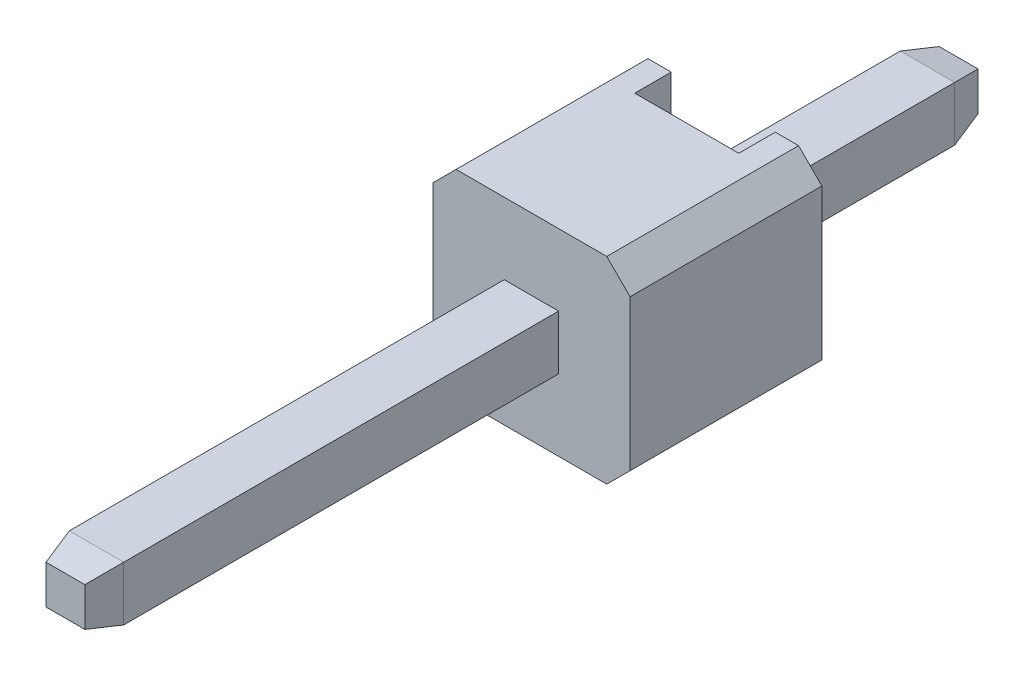
ISO-10303-21;
HEADER;
FILE_DESCRIPTION(('STEP AP214'),'2;1');
FILE_NAME('part.step','',(''),(''),'','','');
FILE_SCHEMA(('AUTOMOTIVE_DESIGN { 1 0 10303 214 1 1 1 1 }'));
ENDSEC;
DATA;
#1=APPLICATION_CONTEXT('core data for automotive mechanical design processes');
#2=APPLICATION_PROTOCOL_DEFINITION('international standard','automotive_design',2000,#1);
#3=PRODUCT_CONTEXT('',#1,'mechanical');
#4=PRODUCT('Part','Part','',(#3));
#5=PRODUCT_RELATED_PRODUCT_CATEGORY('part','',(#4));
#6=PRODUCT_DEFINITION_FORMATION('','',#4);
#7=PRODUCT_DEFINITION_CONTEXT('part definition',#1,'design');
#8=PRODUCT_DEFINITION('design','',#6,#7);
#9=PRODUCT_DEFINITION_SHAPE('','',#8);
#10=(LENGTH_UNIT() NAMED_UNIT(*) SI_UNIT(.MILLI.,.METRE.));
#11=(NAMED_UNIT(*) PLANE_ANGLE_UNIT() SI_UNIT($,.RADIAN.));
#12=(NAMED_UNIT(*) SI_UNIT($,.STERADIAN.) SOLID_ANGLE_UNIT());
#13=UNCERTAINTY_MEASURE_WITH_UNIT(LENGTH_MEASURE(1.E-05),#10,'distance_accuracy_value','');
#14=(GEOMETRIC_REPRESENTATION_CONTEXT(3) GLOBAL_UNCERTAINTY_ASSIGNED_CONTEXT((#13)) GLOBAL_UNIT_ASSIGNED_CONTEXT((#10,
#11,#12)) REPRESENTATION_CONTEXT('',''));
#15=CARTESIAN_POINT('',(0.,0.,0.));
#16=DIRECTION('',(0.,0.,1.));
#17=DIRECTION('',(1.,0.,0.));
#18=AXIS2_PLACEMENT_3D('',#15,#16,#17);
#19=CARTESIAN_POINT('',(0.,-0.25,8.5));
#20=DIRECTION('',(0.,0.970142500145391,-0.242535625036098));
#21=DIRECTION('',(-1.,0.,0.));
#22=AXIS2_PLACEMENT_3D('',#19,#20,#21);
#23=PLANE('',#22);
#24=DIRECTION('',(-0.23570226039596,-0.23570226039596,-0.942809041581841));
#25=VECTOR('',#24,1.);
#26=CARTESIAN_POINT('',(-0.236111111111,-0.236111111111,8.555555555556));
#27=LINE('',#26,#25);
#28=CARTESIAN_POINT('',(-0.25,-0.25,8.5));
#29=VERTEX_POINT('',#28);
#30=CARTESIAN_POINT('',(-0.35,-0.35,8.1));
#31=VERTEX_POINT('',#30);
#32=EDGE_CURVE('E26',#29,#31,#27,.T.);
#33=ORIENTED_EDGE('',*,*,#32,.T.);
#34=DIRECTION('',(-1.,0.,0.));
#35=VECTOR('',#34,1.);
#36=CARTESIAN_POINT('',(-0.35,-0.35,8.1));
#37=LINE('',#36,#35);
#38=CARTESIAN_POINT('',(0.35,-0.35,8.1));
#39=VERTEX_POINT('',#38);
#40=EDGE_CURVE('E487',#39,#31,#37,.T.);
#41=ORIENTED_EDGE('',*,*,#40,.F.);
#42=DIRECTION('',(-0.23570226039596,0.23570226039596,0.942809041581841));
#43=VECTOR('',#42,1.);
#44=CARTESIAN_POINT('',(0.236111111111,-0.236111111111,8.555555555556));
#45=LINE('',#44,#43);
#46=CARTESIAN_POINT('',(0.25,-0.25,8.5));
#47=VERTEX_POINT('',#46);
#48=EDGE_CURVE('E11',#39,#47,#45,.T.);
#49=ORIENTED_EDGE('',*,*,#48,.T.);
#50=DIRECTION('',(1.,0.,0.));
#51=VECTOR('',#50,1.);
#52=CARTESIAN_POINT('',(0.,-0.25,8.5));
#53=LINE('',#52,#51);
#54=EDGE_CURVE('E452',#29,#47,#53,.T.);
#55=ORIENTED_EDGE('',*,*,#54,.F.);
#56=EDGE_LOOP('',(#33,#41,#49,#55));
#57=FACE_BOUND('',#56,.T.);
#58=ADVANCED_FACE('F17',(#57),#23,.F.);
#59=CARTESIAN_POINT('',(0.25,0.,8.5));
#60=DIRECTION('',(-0.970142500145391,0.,-0.242535625036098));
#61=DIRECTION('',(-0.242535625036098,0.,0.970142500145391));
#62=AXIS2_PLACEMENT_3D('',#59,#60,#61);
#63=PLANE('',#62);
#64=DIRECTION('',(-0.23570226039596,-0.23570226039596,0.942809041581841));
#65=VECTOR('',#64,1.);
#66=CARTESIAN_POINT('',(0.236111111111,0.236111111111,8.555555555556));
#67=LINE('',#66,#65);
#68=CARTESIAN_POINT('',(0.35,0.35,8.1));
#69=VERTEX_POINT('',#68);
#70=CARTESIAN_POINT('',(0.25,0.25,8.5));
#71=VERTEX_POINT('',#70);
#72=EDGE_CURVE('E519',#69,#71,#67,.T.);
#73=ORIENTED_EDGE('',*,*,#72,.T.);
#74=DIRECTION('',(0.,1.,0.));
#75=VECTOR('',#74,1.);
#76=CARTESIAN_POINT('',(0.25,0.,8.5));
#77=LINE('',#76,#75);
#78=EDGE_CURVE('E456',#47,#71,#77,.T.);
#79=ORIENTED_EDGE('',*,*,#78,.F.);
#80=ORIENTED_EDGE('',*,*,#48,.F.);
#81=DIRECTION('',(0.,-1.,0.));
#82=VECTOR('',#81,1.);
#83=CARTESIAN_POINT('',(0.35,0.35,8.1));
#84=LINE('',#83,#82);
#85=EDGE_CURVE('E491',#69,#39,#84,.T.);
#86=ORIENTED_EDGE('',*,*,#85,.F.);
#87=EDGE_LOOP('',(#73,#79,#80,#86));
#88=FACE_BOUND('',#87,.T.);
#89=ADVANCED_FACE('F556',(#88),#63,.F.);
#90=CARTESIAN_POINT('',(-0.25,0.,8.5));
#91=DIRECTION('',(0.970142500145391,0.,-0.242535625036098));
#92=DIRECTION('',(0.,-1.,0.));
#93=AXIS2_PLACEMENT_3D('',#90,#91,#92);
#94=PLANE('',#93);
#95=DIRECTION('',(-0.23570226039596,0.23570226039596,-0.942809041581841));
#96=VECTOR('',#95,1.);
#97=CARTESIAN_POINT('',(-0.236111111111,0.236111111111,8.555555555556));
#98=LINE('',#97,#96);
#99=CARTESIAN_POINT('',(-0.25,0.25,8.5));
#100=VERTEX_POINT('',#99);
#101=CARTESIAN_POINT('',(-0.35,0.35,8.1));
#102=VERTEX_POINT('',#101);
#103=EDGE_CURVE('E20',#100,#102,#98,.T.);
#104=ORIENTED_EDGE('',*,*,#103,.T.);
#105=DIRECTION('',(0.,1.,0.));
#106=VECTOR('',#105,1.);
#107=CARTESIAN_POINT('',(-0.35,0.35,8.1));
#108=LINE('',#107,#106);
#109=EDGE_CURVE('E477',#31,#102,#108,.T.);
#110=ORIENTED_EDGE('',*,*,#109,.F.);
#111=ORIENTED_EDGE('',*,*,#32,.F.);
#112=DIRECTION('',(0.,-1.,0.));
#113=VECTOR('',#112,1.);
#114=CARTESIAN_POINT('',(-0.25,0.,8.5));
#115=LINE('',#114,#113);
#116=EDGE_CURVE('E383',#100,#29,#115,.T.);
#117=ORIENTED_EDGE('',*,*,#116,.F.);
#118=EDGE_LOOP('',(#104,#110,#111,#117));
#119=FACE_BOUND('',#118,.T.);
#120=ADVANCED_FACE('F562',(#119),#94,.F.);
#121=CARTESIAN_POINT('',(0.,0.25,8.5));
#122=DIRECTION('',(0.,-0.970142500145391,-0.242535625036098));
#123=DIRECTION('',(0.,0.242535625036098,-0.970142500145391));
#124=AXIS2_PLACEMENT_3D('',#121,#122,#123);
#125=PLANE('',#124);
#126=ORIENTED_EDGE('',*,*,#72,.F.);
#127=DIRECTION('',(1.,0.,0.));
#128=VECTOR('',#127,1.);
#129=CARTESIAN_POINT('',(-0.35,0.35,8.1));
#130=LINE('',#129,#128);
#131=EDGE_CURVE('E402',#102,#69,#130,.T.);
#132=ORIENTED_EDGE('',*,*,#131,.F.);
#133=ORIENTED_EDGE('',*,*,#103,.F.);
#134=DIRECTION('',(-1.,0.,0.));
#135=VECTOR('',#134,1.);
#136=CARTESIAN_POINT('',(0.,0.25,8.5));
#137=LINE('',#136,#135);
#138=EDGE_CURVE('E403',#71,#100,#137,.T.);
#139=ORIENTED_EDGE('',*,*,#138,.F.);
#140=EDGE_LOOP('',(#126,#132,#133,#139));
#141=FACE_BOUND('',#140,.T.);
#142=ADVANCED_FACE('F585',(#141),#125,.F.);
#143=CARTESIAN_POINT('',(-0.35,0.35,-2.6));
#144=DIRECTION('',(0.,0.970142500145391,-0.242535625036098));
#145=DIRECTION('',(-1.,0.,0.));
#146=AXIS2_PLACEMENT_3D('',#143,#144,#145);
#147=PLANE('',#146);
#148=DIRECTION('',(-0.23570226039596,-0.23570226039596,-0.942809041581841));
#149=VECTOR('',#148,1.);
#150=CARTESIAN_POINT('',(0.35,0.35,-2.6));
#151=LINE('',#150,#149);
#152=CARTESIAN_POINT('',(0.35,0.35,-2.6));
#153=VERTEX_POINT('',#152);
#154=CARTESIAN_POINT('',(0.25,0.25,-3.));
#155=VERTEX_POINT('',#154);
#156=EDGE_CURVE('E49',#153,#155,#151,.T.);
#157=ORIENTED_EDGE('',*,*,#156,.T.);
#158=DIRECTION('',(1.,0.,0.));
#159=VECTOR('',#158,1.);
#160=CARTESIAN_POINT('',(0.35,0.25,-3.));
#161=LINE('',#160,#159);
#162=CARTESIAN_POINT('',(-0.25,0.25,-3.));
#163=VERTEX_POINT('',#162);
#164=EDGE_CURVE('E508',#163,#155,#161,.T.);
#165=ORIENTED_EDGE('',*,*,#164,.F.);
#166=DIRECTION('',(-0.23570226039596,0.23570226039596,0.942809041581841));
#167=VECTOR('',#166,1.);
#168=CARTESIAN_POINT('',(-0.35,0.35,-2.6));
#169=LINE('',#168,#167);
#170=CARTESIAN_POINT('',(-0.35,0.35,-2.6));
#171=VERTEX_POINT('',#170);
#172=EDGE_CURVE('E522',#163,#171,#169,.T.);
#173=ORIENTED_EDGE('',*,*,#172,.T.);
#174=DIRECTION('',(-1.,0.,0.));
#175=VECTOR('',#174,1.);
#176=CARTESIAN_POINT('',(-0.35,0.35,-2.6));
#177=LINE('',#176,#175);
#178=EDGE_CURVE('E339',#153,#171,#177,.T.);
#179=ORIENTED_EDGE('',*,*,#178,.F.);
#180=EDGE_LOOP('',(#157,#165,#173,#179));
#181=FACE_BOUND('',#180,.T.);
#182=ADVANCED_FACE('F527',(#181),#147,.T.);
#183=CARTESIAN_POINT('',(-0.35,0.35,-2.6));
#184=DIRECTION('',(-0.970142500145391,0.,-0.242535625036098));
#185=DIRECTION('',(-0.242535625036098,0.,0.970142500145391));
#186=AXIS2_PLACEMENT_3D('',#183,#184,#185);
#187=PLANE('',#186);
#188=DIRECTION('',(-0.23570226039596,-0.23570226039596,0.942809041581841));
#189=VECTOR('',#188,1.);
#190=CARTESIAN_POINT('',(-0.35,-0.35,-2.6));
#191=LINE('',#190,#189);
#192=CARTESIAN_POINT('',(-0.25,-0.25,-3.));
#193=VERTEX_POINT('',#192);
#194=CARTESIAN_POINT('',(-0.35,-0.35,-2.6));
#195=VERTEX_POINT('',#194);
#196=EDGE_CURVE('E462',#193,#195,#191,.T.);
#197=ORIENTED_EDGE('',*,*,#196,.T.);
#198=DIRECTION('',(0.,-1.,0.));
#199=VECTOR('',#198,1.);
#200=CARTESIAN_POINT('',(-0.35,-0.35,-2.6));
#201=LINE('',#200,#199);
#202=EDGE_CURVE('E242',#171,#195,#201,.T.);
#203=ORIENTED_EDGE('',*,*,#202,.F.);
#204=ORIENTED_EDGE('',*,*,#172,.F.);
#205=DIRECTION('',(0.,1.,0.));
#206=VECTOR('',#205,1.);
#207=CARTESIAN_POINT('',(-0.25,0.35,-3.));
#208=LINE('',#207,#206);
#209=EDGE_CURVE('E427',#193,#163,#208,.T.);
#210=ORIENTED_EDGE('',*,*,#209,.F.);
#211=EDGE_LOOP('',(#197,#203,#204,#210));
#212=FACE_BOUND('',#211,.T.);
#213=ADVANCED_FACE('F533',(#212),#187,.T.);
#214=CARTESIAN_POINT('',(0.35,0.35,-2.6));
#215=DIRECTION('',(0.970142500145391,0.,-0.242535625036098));
#216=DIRECTION('',(0.,-1.,0.));
#217=AXIS2_PLACEMENT_3D('',#214,#215,#216);
#218=PLANE('',#217);
#219=DIRECTION('',(-0.23570226039596,0.23570226039596,-0.942809041581841));
#220=VECTOR('',#219,1.);
#221=CARTESIAN_POINT('',(0.311111111111,-0.311111111111,-2.755555555556));
#222=LINE('',#221,#220);
#223=CARTESIAN_POINT('',(0.35,-0.35,-2.6));
#224=VERTEX_POINT('',#223);
#225=CARTESIAN_POINT('',(0.25,-0.25,-3.));
#226=VERTEX_POINT('',#225);
#227=EDGE_CURVE('E39',#224,#226,#222,.T.);
#228=ORIENTED_EDGE('',*,*,#227,.T.);
#229=DIRECTION('',(0.,-1.,0.));
#230=VECTOR('',#229,1.);
#231=CARTESIAN_POINT('',(0.25,-0.35,-3.));
#232=LINE('',#231,#230);
#233=EDGE_CURVE('E512',#155,#226,#232,.T.);
#234=ORIENTED_EDGE('',*,*,#233,.F.);
#235=ORIENTED_EDGE('',*,*,#156,.F.);
#236=DIRECTION('',(0.,1.,0.));
#237=VECTOR('',#236,1.);
#238=CARTESIAN_POINT('',(0.35,0.35,-2.6));
#239=LINE('',#238,#237);
#240=EDGE_CURVE('E320',#224,#153,#239,.T.);
#241=ORIENTED_EDGE('',*,*,#240,.F.);
#242=EDGE_LOOP('',(#228,#234,#235,#241));
#243=FACE_BOUND('',#242,.T.);
#244=ADVANCED_FACE('F538',(#243),#218,.T.);
#245=CARTESIAN_POINT('',(-0.35,-0.35,-2.6));
#246=DIRECTION('',(0.,-0.970142500145391,-0.242535625036098));
#247=DIRECTION('',(0.,0.242535625036098,-0.970142500145391));
#248=AXIS2_PLACEMENT_3D('',#245,#246,#247);
#249=PLANE('',#248);
#250=ORIENTED_EDGE('',*,*,#196,.F.);
#251=DIRECTION('',(-1.,0.,0.));
#252=VECTOR('',#251,1.);
#253=CARTESIAN_POINT('',(-0.35,-0.25,-3.));
#254=LINE('',#253,#252);
#255=EDGE_CURVE('E497',#226,#193,#254,.T.);
#256=ORIENTED_EDGE('',*,*,#255,.F.);
#257=ORIENTED_EDGE('',*,*,#227,.F.);
#258=DIRECTION('',(1.,0.,0.));
#259=VECTOR('',#258,1.);
#260=CARTESIAN_POINT('',(0.35,-0.35,-2.6));
#261=LINE('',#260,#259);
#262=EDGE_CURVE('E248',#195,#224,#261,.T.);
#263=ORIENTED_EDGE('',*,*,#262,.F.);
#264=EDGE_LOOP('',(#250,#256,#257,#263));
#265=FACE_BOUND('',#264,.T.);
#266=ADVANCED_FACE('F535',(#265),#249,.T.);
#267=CARTESIAN_POINT('',(0.,0.,-3.));
#268=DIRECTION('',(0.,0.,1.));
#269=DIRECTION('',(1.,0.,0.));
#270=AXIS2_PLACEMENT_3D('',#267,#268,#269);
#271=PLANE('',#270);
#272=ORIENTED_EDGE('',*,*,#209,.T.);
#273=ORIENTED_EDGE('',*,*,#164,.T.);
#274=ORIENTED_EDGE('',*,*,#233,.T.);
#275=ORIENTED_EDGE('',*,*,#255,.T.);
#276=EDGE_LOOP('',(#272,#273,#274,#275));
#277=FACE_BOUND('',#276,.T.);
#278=ADVANCED_FACE('F537',(#277),#271,.F.);
#279=CARTESIAN_POINT('',(-0.35,0.35,-3.));
#280=DIRECTION('',(0.,1.,0.));
#281=DIRECTION('',(1.,0.,0.));
#282=AXIS2_PLACEMENT_3D('',#279,#280,#281);
#283=PLANE('',#282);
#284=DIRECTION('',(0.,0.,1.));
#285=VECTOR('',#284,1.);
#286=CARTESIAN_POINT('',(0.35,0.35,-3.));
#287=LINE('',#286,#285);
#288=CARTESIAN_POINT('',(0.35,0.35,0.5));
#289=VERTEX_POINT('',#288);
#290=EDGE_CURVE('E249',#153,#289,#287,.T.);
#291=ORIENTED_EDGE('',*,*,#290,.F.);
#292=ORIENTED_EDGE('',*,*,#178,.T.);
#293=DIRECTION('',(0.,0.,1.));
#294=VECTOR('',#293,1.);
#295=CARTESIAN_POINT('',(-0.35,0.35,-3.));
#296=LINE('',#295,#294);
#297=CARTESIAN_POINT('',(-0.35,0.35,0.5));
#298=VERTEX_POINT('',#297);
#299=EDGE_CURVE('E340',#171,#298,#296,.T.);
#300=ORIENTED_EDGE('',*,*,#299,.T.);
#301=DIRECTION('',(-1.,0.,0.));
#302=VECTOR('',#301,1.);
#303=CARTESIAN_POINT('',(0.,0.35,0.5));
#304=LINE('',#303,#302);
#305=EDGE_CURVE('E257',#289,#298,#304,.T.);
#306=ORIENTED_EDGE('',*,*,#305,.F.);
#307=EDGE_LOOP('',(#291,#292,#300,#306));
#308=FACE_BOUND('',#307,.T.);
#309=ADVANCED_FACE('F532',(#308),#283,.T.);
#310=CARTESIAN_POINT('',(-0.35,0.35,-3.));
#311=DIRECTION('',(-1.,0.,0.));
#312=DIRECTION('',(0.,0.,1.));
#313=AXIS2_PLACEMENT_3D('',#310,#311,#312);
#314=PLANE('',#313);
#315=ORIENTED_EDGE('',*,*,#299,.F.);
#316=ORIENTED_EDGE('',*,*,#202,.T.);
#317=DIRECTION('',(0.,0.,1.));
#318=VECTOR('',#317,1.);
#319=CARTESIAN_POINT('',(-0.35,-0.35,-3.));
#320=LINE('',#319,#318);
#321=CARTESIAN_POINT('',(-0.35,-0.35,0.5));
#322=VERTEX_POINT('',#321);
#323=EDGE_CURVE('E235',#195,#322,#320,.T.);
#324=ORIENTED_EDGE('',*,*,#323,.T.);
#325=DIRECTION('',(0.,-1.,0.));
#326=VECTOR('',#325,1.);
#327=CARTESIAN_POINT('',(-0.35,0.,0.5));
#328=LINE('',#327,#326);
#329=EDGE_CURVE('E239',#298,#322,#328,.T.);
#330=ORIENTED_EDGE('',*,*,#329,.F.);
#331=EDGE_LOOP('',(#315,#316,#324,#330));
#332=FACE_BOUND('',#331,.T.);
#333=ADVANCED_FACE('F238',(#332),#314,.T.);
#334=CARTESIAN_POINT('',(-0.35,-0.35,-3.));
#335=DIRECTION('',(0.,-1.,0.));
#336=DIRECTION('',(0.,0.,-1.));
#337=AXIS2_PLACEMENT_3D('',#334,#335,#336);
#338=PLANE('',#337);
#339=ORIENTED_EDGE('',*,*,#323,.F.);
#340=ORIENTED_EDGE('',*,*,#262,.T.);
#341=DIRECTION('',(0.,0.,1.));
#342=VECTOR('',#341,1.);
#343=CARTESIAN_POINT('',(0.35,-0.35,-3.));
#344=LINE('',#343,#342);
#345=CARTESIAN_POINT('',(0.35,-0.35,0.5));
#346=VERTEX_POINT('',#345);
#347=EDGE_CURVE('E263',#224,#346,#344,.T.);
#348=ORIENTED_EDGE('',*,*,#347,.T.);
#349=DIRECTION('',(1.,0.,0.));
#350=VECTOR('',#349,1.);
#351=CARTESIAN_POINT('',(0.,-0.35,0.5));
#352=LINE('',#351,#350);
#353=EDGE_CURVE('E255',#322,#346,#352,.T.);
#354=ORIENTED_EDGE('',*,*,#353,.F.);
#355=EDGE_LOOP('',(#339,#340,#348,#354));
#356=FACE_BOUND('',#355,.T.);
#357=ADVANCED_FACE('F261',(#356),#338,.T.);
#358=CARTESIAN_POINT('',(0.35,0.35,-3.));
#359=DIRECTION('',(1.,0.,0.));
#360=DIRECTION('',(0.,1.,0.));
#361=AXIS2_PLACEMENT_3D('',#358,#359,#360);
#362=PLANE('',#361);
#363=ORIENTED_EDGE('',*,*,#347,.F.);
#364=ORIENTED_EDGE('',*,*,#240,.T.);
#365=ORIENTED_EDGE('',*,*,#290,.T.);
#366=DIRECTION('',(0.,1.,0.));
#367=VECTOR('',#366,1.);
#368=CARTESIAN_POINT('',(0.35,0.,0.5));
#369=LINE('',#368,#367);
#370=EDGE_CURVE('E266',#346,#289,#369,.T.);
#371=ORIENTED_EDGE('',*,*,#370,.F.);
#372=EDGE_LOOP('',(#363,#364,#365,#371));
#373=FACE_BOUND('',#372,.T.);
#374=ADVANCED_FACE('F540',(#373),#362,.T.);
#375=CARTESIAN_POINT('',(0.35,0.35,-3.));
#376=DIRECTION('',(1.,0.,0.));
#377=DIRECTION('',(0.,1.,0.));
#378=AXIS2_PLACEMENT_3D('',#375,#376,#377);
#379=PLANE('',#378);
#380=DIRECTION('',(0.,0.,1.));
#381=VECTOR('',#380,1.);
#382=CARTESIAN_POINT('',(0.35,0.35,-3.));
#383=LINE('',#382,#381);
#384=CARTESIAN_POINT('',(0.35,0.35,2.5));
#385=VERTEX_POINT('',#384);
#386=EDGE_CURVE('E469',#385,#69,#383,.T.);
#387=ORIENTED_EDGE('',*,*,#386,.T.);
#388=ORIENTED_EDGE('',*,*,#85,.T.);
#389=DIRECTION('',(0.,0.,1.));
#390=VECTOR('',#389,1.);
#391=CARTESIAN_POINT('',(0.35,-0.35,-3.));
#392=LINE('',#391,#390);
#393=CARTESIAN_POINT('',(0.35,-0.35,2.5));
#394=VERTEX_POINT('',#393);
#395=EDGE_CURVE('E481',#394,#39,#392,.T.);
#396=ORIENTED_EDGE('',*,*,#395,.F.);
#397=DIRECTION('',(0.,1.,0.));
#398=VECTOR('',#397,1.);
#399=CARTESIAN_POINT('',(0.35,0.,2.5));
#400=LINE('',#399,#398);
#401=EDGE_CURVE('E440',#394,#385,#400,.T.);
#402=ORIENTED_EDGE('',*,*,#401,.T.);
#403=EDGE_LOOP('',(#387,#388,#396,#402));
#404=FACE_BOUND('',#403,.T.);
#405=ADVANCED_FACE('F542',(#404),#379,.T.);
#406=CARTESIAN_POINT('',(-0.35,-0.35,-3.));
#407=DIRECTION('',(0.,-1.,0.));
#408=DIRECTION('',(0.,0.,-1.));
#409=AXIS2_PLACEMENT_3D('',#406,#407,#408);
#410=PLANE('',#409);
#411=ORIENTED_EDGE('',*,*,#395,.T.);
#412=ORIENTED_EDGE('',*,*,#40,.T.);
#413=DIRECTION('',(0.,0.,1.));
#414=VECTOR('',#413,1.);
#415=CARTESIAN_POINT('',(-0.35,-0.35,-3.));
#416=LINE('',#415,#414);
#417=CARTESIAN_POINT('',(-0.35,-0.35,2.5));
#418=VERTEX_POINT('',#417);
#419=EDGE_CURVE('E473',#418,#31,#416,.T.);
#420=ORIENTED_EDGE('',*,*,#419,.F.);
#421=DIRECTION('',(1.,0.,0.));
#422=VECTOR('',#421,1.);
#423=CARTESIAN_POINT('',(0.,-0.35,2.5));
#424=LINE('',#423,#422);
#425=EDGE_CURVE('E387',#418,#394,#424,.T.);
#426=ORIENTED_EDGE('',*,*,#425,.T.);
#427=EDGE_LOOP('',(#411,#412,#420,#426));
#428=FACE_BOUND('',#427,.T.);
#429=ADVANCED_FACE('F550',(#428),#410,.T.);
#430=CARTESIAN_POINT('',(-0.35,0.35,-3.));
#431=DIRECTION('',(-1.,0.,0.));
#432=DIRECTION('',(0.,0.,1.));
#433=AXIS2_PLACEMENT_3D('',#430,#431,#432);
#434=PLANE('',#433);
#435=ORIENTED_EDGE('',*,*,#419,.T.);
#436=ORIENTED_EDGE('',*,*,#109,.T.);
#437=DIRECTION('',(0.,0.,1.));
#438=VECTOR('',#437,1.);
#439=CARTESIAN_POINT('',(-0.35,0.35,-3.));
#440=LINE('',#439,#438);
#441=CARTESIAN_POINT('',(-0.35,0.35,2.5));
#442=VERTEX_POINT('',#441);
#443=EDGE_CURVE('E398',#442,#102,#440,.T.);
#444=ORIENTED_EDGE('',*,*,#443,.F.);
#445=DIRECTION('',(0.,-1.,0.));
#446=VECTOR('',#445,1.);
#447=CARTESIAN_POINT('',(-0.35,0.,2.5));
#448=LINE('',#447,#446);
#449=EDGE_CURVE('E326',#442,#418,#448,.T.);
#450=ORIENTED_EDGE('',*,*,#449,.T.);
#451=EDGE_LOOP('',(#435,#436,#444,#450));
#452=FACE_BOUND('',#451,.T.);
#453=ADVANCED_FACE('F572',(#452),#434,.T.);
#454=CARTESIAN_POINT('',(-0.35,0.35,-3.));
#455=DIRECTION('',(0.,1.,0.));
#456=DIRECTION('',(1.,0.,0.));
#457=AXIS2_PLACEMENT_3D('',#454,#455,#456);
#458=PLANE('',#457);
#459=ORIENTED_EDGE('',*,*,#443,.T.);
#460=ORIENTED_EDGE('',*,*,#131,.T.);
#461=ORIENTED_EDGE('',*,*,#386,.F.);
#462=DIRECTION('',(-1.,0.,0.));
#463=VECTOR('',#462,1.);
#464=CARTESIAN_POINT('',(0.,0.35,2.5));
#465=LINE('',#464,#463);
#466=EDGE_CURVE('E321',#385,#442,#465,.T.);
#467=ORIENTED_EDGE('',*,*,#466,.T.);
#468=EDGE_LOOP('',(#459,#460,#461,#467));
#469=FACE_BOUND('',#468,.T.);
#470=ADVANCED_FACE('F697',(#469),#458,.T.);
#471=CARTESIAN_POINT('',(0.,0.,8.5));
#472=DIRECTION('',(0.,0.,1.));
#473=DIRECTION('',(1.,0.,0.));
#474=AXIS2_PLACEMENT_3D('',#471,#472,#473);
#475=PLANE('',#474);
#476=ORIENTED_EDGE('',*,*,#116,.T.);
#477=ORIENTED_EDGE('',*,*,#54,.T.);
#478=ORIENTED_EDGE('',*,*,#78,.T.);
#479=ORIENTED_EDGE('',*,*,#138,.T.);
#480=EDGE_LOOP('',(#476,#477,#478,#479));
#481=FACE_BOUND('',#480,.T.);
#482=ADVANCED_FACE('F583',(#481),#475,.T.);
#483=CARTESIAN_POINT('',(0.,0.,0.03));
#484=DIRECTION('',(0.,0.,1.));
#485=DIRECTION('',(1.,0.,0.));
#486=AXIS2_PLACEMENT_3D('',#483,#484,#485);
#487=PLANE('',#486);
#488=DIRECTION('',(0.,1.,0.));
#489=VECTOR('',#488,1.);
#490=CARTESIAN_POINT('',(-0.67,1.27,0.03));
#491=LINE('',#490,#489);
#492=CARTESIAN_POINT('',(-0.67,-1.27,0.03));
#493=VERTEX_POINT('',#492);
#494=CARTESIAN_POINT('',(-0.67,1.27,0.03));
#495=VERTEX_POINT('',#494);
#496=EDGE_CURVE('E380',#493,#495,#491,.T.);
#497=ORIENTED_EDGE('',*,*,#496,.F.);
#498=DIRECTION('',(1.,0.,0.));
#499=VECTOR('',#498,1.);
#500=CARTESIAN_POINT('',(-0.97,-1.27,0.03));
#501=LINE('',#500,#499);
#502=CARTESIAN_POINT('',(-0.97,-1.27,0.03));
#503=VERTEX_POINT('',#502);
#504=EDGE_CURVE('E282',#503,#493,#501,.T.);
#505=ORIENTED_EDGE('',*,*,#504,.F.);
#506=DIRECTION('',(0.707106781186548,-0.707106781186548,0.));
#507=VECTOR('',#506,1.);
#508=CARTESIAN_POINT('',(-1.27,-0.97,0.03));
#509=LINE('',#508,#507);
#510=CARTESIAN_POINT('',(-1.27,-0.97,0.03));
#511=VERTEX_POINT('',#510);
#512=EDGE_CURVE('E309',#511,#503,#509,.T.);
#513=ORIENTED_EDGE('',*,*,#512,.F.);
#514=DIRECTION('',(0.,-1.,0.));
#515=VECTOR('',#514,1.);
#516=CARTESIAN_POINT('',(-1.27,0.97,0.03));
#517=LINE('',#516,#515);
#518=CARTESIAN_POINT('',(-1.27,0.97,0.03));
#519=VERTEX_POINT('',#518);
#520=EDGE_CURVE('E355',#519,#511,#517,.T.);
#521=ORIENTED_EDGE('',*,*,#520,.F.);
#522=DIRECTION('',(-0.707106781186548,-0.707106781186548,0.));
#523=VECTOR('',#522,1.);
#524=CARTESIAN_POINT('',(-0.97,1.27,0.03));
#525=LINE('',#524,#523);
#526=CARTESIAN_POINT('',(-0.97,1.27,0.03));
#527=VERTEX_POINT('',#526);
#528=EDGE_CURVE('E423',#527,#519,#525,.T.);
#529=ORIENTED_EDGE('',*,*,#528,.F.);
#530=DIRECTION('',(-1.,0.,0.));
#531=VECTOR('',#530,1.);
#532=CARTESIAN_POINT('',(-0.67,1.27,0.03));
#533=LINE('',#532,#531);
#534=EDGE_CURVE('E407',#495,#527,#533,.T.);
#535=ORIENTED_EDGE('',*,*,#534,.F.);
#536=EDGE_LOOP('',(#497,#505,#513,#521,#529,#535));
#537=FACE_BOUND('',#536,.T.);
#538=ADVANCED_FACE('F696',(#537),#487,.F.);
#539=CARTESIAN_POINT('',(-0.67,1.27,0.53));
#540=DIRECTION('',(-1.,0.,0.));
#541=DIRECTION('',(0.,0.,1.));
#542=AXIS2_PLACEMENT_3D('',#539,#540,#541);
#543=PLANE('',#542);
#544=DIRECTION('',(0.,0.,-1.));
#545=VECTOR('',#544,1.);
#546=CARTESIAN_POINT('',(-0.67,1.27,0.53));
#547=LINE('',#546,#545);
#548=CARTESIAN_POINT('',(-0.67,1.27,0.5));
#549=VERTEX_POINT('',#548);
#550=EDGE_CURVE('E397',#549,#495,#547,.T.);
#551=ORIENTED_EDGE('',*,*,#550,.F.);
#552=DIRECTION('',(0.,-1.,0.));
#553=VECTOR('',#552,1.);
#554=CARTESIAN_POINT('',(-0.67,0.,0.5));
#555=LINE('',#554,#553);
#556=CARTESIAN_POINT('',(-0.67,-1.27,0.5));
#557=VERTEX_POINT('',#556);
#558=EDGE_CURVE('E259',#549,#557,#555,.T.);
#559=ORIENTED_EDGE('',*,*,#558,.T.);
#560=DIRECTION('',(0.,0.,-1.));
#561=VECTOR('',#560,1.);
#562=CARTESIAN_POINT('',(-0.67,-1.27,0.53));
#563=LINE('',#562,#561);
#564=EDGE_CURVE('E278',#557,#493,#563,.T.);
#565=ORIENTED_EDGE('',*,*,#564,.T.);
#566=ORIENTED_EDGE('',*,*,#496,.T.);
#567=EDGE_LOOP('',(#551,#559,#565,#566));
#568=FACE_BOUND('',#567,.T.);
#569=ADVANCED_FACE('F712',(#568),#543,.F.);
#570=CARTESIAN_POINT('',(0.,0.,0.03));
#571=DIRECTION('',(0.,0.,1.));
#572=DIRECTION('',(1.,0.,0.));
#573=AXIS2_PLACEMENT_3D('',#570,#571,#572);
#574=PLANE('',#573);
#575=DIRECTION('',(0.,-1.,0.));
#576=VECTOR('',#575,1.);
#577=CARTESIAN_POINT('',(0.67,1.27,0.03));
#578=LINE('',#577,#576);
#579=CARTESIAN_POINT('',(0.67,1.27,0.03));
#580=VERTEX_POINT('',#579);
#581=CARTESIAN_POINT('',(0.67,-1.27,0.03));
#582=VERTEX_POINT('',#581);
#583=EDGE_CURVE('E325',#580,#582,#578,.T.);
#584=ORIENTED_EDGE('',*,*,#583,.F.);
#585=DIRECTION('',(-1.,0.,0.));
#586=VECTOR('',#585,1.);
#587=CARTESIAN_POINT('',(0.97,1.27,0.03));
#588=LINE('',#587,#586);
#589=CARTESIAN_POINT('',(0.97,1.27,0.03));
#590=VERTEX_POINT('',#589);
#591=EDGE_CURVE('E388',#590,#580,#588,.T.);
#592=ORIENTED_EDGE('',*,*,#591,.F.);
#593=DIRECTION('',(-0.707106781186548,0.707106781186548,0.));
#594=VECTOR('',#593,1.);
#595=CARTESIAN_POINT('',(1.27,0.97,0.03));
#596=LINE('',#595,#594);
#597=CARTESIAN_POINT('',(1.27,0.97,0.03));
#598=VERTEX_POINT('',#597);
#599=EDGE_CURVE('E373',#598,#590,#596,.T.);
#600=ORIENTED_EDGE('',*,*,#599,.F.);
#601=DIRECTION('',(0.,1.,0.));
#602=VECTOR('',#601,1.);
#603=CARTESIAN_POINT('',(1.27,-0.97,0.03));
#604=LINE('',#603,#602);
#605=CARTESIAN_POINT('',(1.27,-0.97,0.03));
#606=VERTEX_POINT('',#605);
#607=EDGE_CURVE('E354',#606,#598,#604,.T.);
#608=ORIENTED_EDGE('',*,*,#607,.F.);
#609=DIRECTION('',(0.707106781186548,0.707106781186548,0.));
#610=VECTOR('',#609,1.);
#611=CARTESIAN_POINT('',(0.97,-1.27,0.03));
#612=LINE('',#611,#610);
#613=CARTESIAN_POINT('',(0.97,-1.27,0.03));
#614=VERTEX_POINT('',#613);
#615=EDGE_CURVE('E273',#614,#606,#612,.T.);
#616=ORIENTED_EDGE('',*,*,#615,.F.);
#617=DIRECTION('',(1.,0.,0.));
#618=VECTOR('',#617,1.);
#619=CARTESIAN_POINT('',(0.67,-1.27,0.03));
#620=LINE('',#619,#618);
#621=EDGE_CURVE('E293',#582,#614,#620,.T.);
#622=ORIENTED_EDGE('',*,*,#621,.F.);
#623=EDGE_LOOP('',(#584,#592,#600,#608,#616,#622));
#624=FACE_BOUND('',#623,.T.);
#625=ADVANCED_FACE('F671',(#624),#574,.F.);
#626=CARTESIAN_POINT('',(0.67,1.27,0.53));
#627=DIRECTION('',(1.,0.,0.));
#628=DIRECTION('',(0.,1.,0.));
#629=AXIS2_PLACEMENT_3D('',#626,#627,#628);
#630=PLANE('',#629);
#631=DIRECTION('',(0.,0.,-1.));
#632=VECTOR('',#631,1.);
#633=CARTESIAN_POINT('',(0.67,-1.27,0.53));
#634=LINE('',#633,#632);
#635=CARTESIAN_POINT('',(0.67,-1.27,0.5));
#636=VERTEX_POINT('',#635);
#637=EDGE_CURVE('E281',#636,#582,#634,.T.);
#638=ORIENTED_EDGE('',*,*,#637,.F.);
#639=DIRECTION('',(0.,1.,0.));
#640=VECTOR('',#639,1.);
#641=CARTESIAN_POINT('',(0.67,0.,0.5));
#642=LINE('',#641,#640);
#643=CARTESIAN_POINT('',(0.67,1.27,0.5));
#644=VERTEX_POINT('',#643);
#645=EDGE_CURVE('E297',#636,#644,#642,.T.);
#646=ORIENTED_EDGE('',*,*,#645,.T.);
#647=DIRECTION('',(0.,0.,-1.));
#648=VECTOR('',#647,1.);
#649=CARTESIAN_POINT('',(0.67,1.27,0.53));
#650=LINE('',#649,#648);
#651=EDGE_CURVE('E392',#644,#580,#650,.T.);
#652=ORIENTED_EDGE('',*,*,#651,.T.);
#653=ORIENTED_EDGE('',*,*,#583,.T.);
#654=EDGE_LOOP('',(#638,#646,#652,#653));
#655=FACE_BOUND('',#654,.T.);
#656=ADVANCED_FACE('F667',(#655),#630,.F.);
#657=CARTESIAN_POINT('',(0.,0.,2.5));
#658=DIRECTION('',(0.,0.,1.));
#659=DIRECTION('',(1.,0.,0.));
#660=AXIS2_PLACEMENT_3D('',#657,#658,#659);
#661=PLANE('',#660);
#662=DIRECTION('',(0.707106781186548,-0.707106781186548,0.));
#663=VECTOR('',#662,1.);
#664=CARTESIAN_POINT('',(-1.27,-0.97,2.5));
#665=LINE('',#664,#663);
#666=CARTESIAN_POINT('',(-1.27,-0.97,2.5));
#667=VERTEX_POINT('',#666);
#668=CARTESIAN_POINT('',(-0.97,-1.27,2.5));
#669=VERTEX_POINT('',#668);
#670=EDGE_CURVE('E317',#667,#669,#665,.T.);
#671=ORIENTED_EDGE('',*,*,#670,.T.);
#672=DIRECTION('',(1.,0.,0.));
#673=VECTOR('',#672,1.);
#674=CARTESIAN_POINT('',(-0.97,-1.27,2.5));
#675=LINE('',#674,#673);
#676=CARTESIAN_POINT('',(0.97,-1.27,2.5));
#677=VERTEX_POINT('',#676);
#678=EDGE_CURVE('E277',#669,#677,#675,.T.);
#679=ORIENTED_EDGE('',*,*,#678,.T.);
#680=DIRECTION('',(0.707106781186548,0.707106781186548,0.));
#681=VECTOR('',#680,1.);
#682=CARTESIAN_POINT('',(0.97,-1.27,2.5));
#683=LINE('',#682,#681);
#684=CARTESIAN_POINT('',(1.27,-0.97,2.5));
#685=VERTEX_POINT('',#684);
#686=EDGE_CURVE('E350',#677,#685,#683,.T.);
#687=ORIENTED_EDGE('',*,*,#686,.T.);
#688=DIRECTION('',(0.,1.,0.));
#689=VECTOR('',#688,1.);
#690=CARTESIAN_POINT('',(1.27,0.97,2.5));
#691=LINE('',#690,#689);
#692=CARTESIAN_POINT('',(1.27,0.97,2.5));
#693=VERTEX_POINT('',#692);
#694=EDGE_CURVE('E367',#685,#693,#691,.T.);
#695=ORIENTED_EDGE('',*,*,#694,.T.);
#696=DIRECTION('',(-0.707106781186548,0.707106781186548,0.));
#697=VECTOR('',#696,1.);
#698=CARTESIAN_POINT('',(0.97,1.27,2.5));
#699=LINE('',#698,#697);
#700=CARTESIAN_POINT('',(0.97,1.27,2.5));
#701=VERTEX_POINT('',#700);
#702=EDGE_CURVE('E372',#693,#701,#699,.T.);
#703=ORIENTED_EDGE('',*,*,#702,.T.);
#704=DIRECTION('',(-1.,0.,0.));
#705=VECTOR('',#704,1.);
#706=CARTESIAN_POINT('',(-0.97,1.27,2.5));
#707=LINE('',#706,#705);
#708=CARTESIAN_POINT('',(-0.97,1.27,2.5));
#709=VERTEX_POINT('',#708);
#710=EDGE_CURVE('E393',#701,#709,#707,.T.);
#711=ORIENTED_EDGE('',*,*,#710,.T.);
#712=DIRECTION('',(-0.707106781186548,-0.707106781186548,0.));
#713=VECTOR('',#712,1.);
#714=CARTESIAN_POINT('',(-1.27,0.97,2.5));
#715=LINE('',#714,#713);
#716=CARTESIAN_POINT('',(-1.27,0.97,2.5));
#717=VERTEX_POINT('',#716);
#718=EDGE_CURVE('E359',#709,#717,#715,.T.);
#719=ORIENTED_EDGE('',*,*,#718,.T.);
#720=DIRECTION('',(0.,-1.,0.));
#721=VECTOR('',#720,1.);
#722=CARTESIAN_POINT('',(-1.27,0.97,2.5));
#723=LINE('',#722,#721);
#724=EDGE_CURVE('E358',#717,#667,#723,.T.);
#725=ORIENTED_EDGE('',*,*,#724,.T.);
#726=EDGE_LOOP('',(#671,#679,#687,#695,#703,#711,#719,#725));
#727=FACE_BOUND('',#726,.T.);
#728=ORIENTED_EDGE('',*,*,#401,.F.);
#729=ORIENTED_EDGE('',*,*,#425,.F.);
#730=ORIENTED_EDGE('',*,*,#449,.F.);
#731=ORIENTED_EDGE('',*,*,#466,.F.);
#732=EDGE_LOOP('',(#728,#729,#730,#731));
#733=FACE_BOUND('',#732,.T.);
#734=ADVANCED_FACE('F578',(#727,#733),#661,.T.);
#735=CARTESIAN_POINT('',(-1.27,0.97,2.5));
#736=DIRECTION('',(1.,0.,0.));
#737=DIRECTION('',(0.,1.,0.));
#738=AXIS2_PLACEMENT_3D('',#735,#736,#737);
#739=PLANE('',#738);
#740=DIRECTION('',(0.,0.,-1.));
#741=VECTOR('',#740,1.);
#742=CARTESIAN_POINT('',(-1.27,0.97,2.5));
#743=LINE('',#742,#741);
#744=EDGE_CURVE('E431',#717,#519,#743,.T.);
#745=ORIENTED_EDGE('',*,*,#744,.T.);
#746=ORIENTED_EDGE('',*,*,#520,.T.);
#747=DIRECTION('',(0.,0.,-1.));
#748=VECTOR('',#747,1.);
#749=CARTESIAN_POINT('',(-1.27,-0.97,2.5));
#750=LINE('',#749,#748);
#751=EDGE_CURVE('E304',#667,#511,#750,.T.);
#752=ORIENTED_EDGE('',*,*,#751,.F.);
#753=ORIENTED_EDGE('',*,*,#724,.F.);
#754=EDGE_LOOP('',(#745,#746,#752,#753));
#755=FACE_BOUND('',#754,.T.);
#756=ADVANCED_FACE('F628',(#755),#739,.F.);
#757=CARTESIAN_POINT('',(-1.27,0.97,2.5));
#758=DIRECTION('',(0.707106781186548,-0.707106781186548,0.));
#759=DIRECTION('',(0.,0.,-1.));
#760=AXIS2_PLACEMENT_3D('',#757,#758,#759);
#761=PLANE('',#760);
#762=DIRECTION('',(0.,0.,-1.));
#763=VECTOR('',#762,1.);
#764=CARTESIAN_POINT('',(-0.97,1.27,2.5));
#765=LINE('',#764,#763);
#766=EDGE_CURVE('E410',#709,#527,#765,.T.);
#767=ORIENTED_EDGE('',*,*,#766,.T.);
#768=ORIENTED_EDGE('',*,*,#528,.T.);
#769=ORIENTED_EDGE('',*,*,#744,.F.);
#770=ORIENTED_EDGE('',*,*,#718,.F.);
#771=EDGE_LOOP('',(#767,#768,#769,#770));
#772=FACE_BOUND('',#771,.T.);
#773=ADVANCED_FACE('F632',(#772),#761,.F.);
#774=CARTESIAN_POINT('',(-0.97,1.27,2.5));
#775=DIRECTION('',(0.,-1.,0.));
#776=DIRECTION('',(0.,0.,-1.));
#777=AXIS2_PLACEMENT_3D('',#774,#775,#776);
#778=PLANE('',#777);
#779=DIRECTION('',(-1.,0.,0.));
#780=VECTOR('',#779,1.);
#781=CARTESIAN_POINT('',(-0.97,1.27,0.5));
#782=LINE('',#781,#780);
#783=EDGE_CURVE('E289',#644,#549,#782,.T.);
#784=ORIENTED_EDGE('',*,*,#783,.T.);
#785=ORIENTED_EDGE('',*,*,#550,.T.);
#786=ORIENTED_EDGE('',*,*,#534,.T.);
#787=ORIENTED_EDGE('',*,*,#766,.F.);
#788=ORIENTED_EDGE('',*,*,#710,.F.);
#789=DIRECTION('',(0.,0.,-1.));
#790=VECTOR('',#789,1.);
#791=CARTESIAN_POINT('',(0.97,1.27,2.5));
#792=LINE('',#791,#790);
#793=EDGE_CURVE('E368',#701,#590,#792,.T.);
#794=ORIENTED_EDGE('',*,*,#793,.T.);
#795=ORIENTED_EDGE('',*,*,#591,.T.);
#796=ORIENTED_EDGE('',*,*,#651,.F.);
#797=EDGE_LOOP('',(#784,#785,#786,#787,#788,#794,#795,#796));
#798=FACE_BOUND('',#797,.T.);
#799=ADVANCED_FACE('F650',(#798),#778,.F.);
#800=CARTESIAN_POINT('',(0.97,1.27,2.5));
#801=DIRECTION('',(-0.707106781186548,-0.707106781186548,0.));
#802=DIRECTION('',(-0.707106781186548,0.707106781186548,0.));
#803=AXIS2_PLACEMENT_3D('',#800,#801,#802);
#804=PLANE('',#803);
#805=DIRECTION('',(0.,0.,-1.));
#806=VECTOR('',#805,1.);
#807=CARTESIAN_POINT('',(1.27,0.97,2.5));
#808=LINE('',#807,#806);
#809=EDGE_CURVE('E363',#693,#598,#808,.T.);
#810=ORIENTED_EDGE('',*,*,#809,.T.);
#811=ORIENTED_EDGE('',*,*,#599,.T.);
#812=ORIENTED_EDGE('',*,*,#793,.F.);
#813=ORIENTED_EDGE('',*,*,#702,.F.);
#814=EDGE_LOOP('',(#810,#811,#812,#813));
#815=FACE_BOUND('',#814,.T.);
#816=ADVANCED_FACE('F641',(#815),#804,.F.);
#817=CARTESIAN_POINT('',(1.27,0.97,2.5));
#818=DIRECTION('',(-1.,0.,0.));
#819=DIRECTION('',(0.,1.,0.));
#820=AXIS2_PLACEMENT_3D('',#817,#818,#819);
#821=PLANE('',#820);
#822=DIRECTION('',(0.,0.,-1.));
#823=VECTOR('',#822,1.);
#824=CARTESIAN_POINT('',(1.27,-0.97,2.5));
#825=LINE('',#824,#823);
#826=EDGE_CURVE('E276',#685,#606,#825,.T.);
#827=ORIENTED_EDGE('',*,*,#826,.T.);
#828=ORIENTED_EDGE('',*,*,#607,.T.);
#829=ORIENTED_EDGE('',*,*,#809,.F.);
#830=ORIENTED_EDGE('',*,*,#694,.F.);
#831=EDGE_LOOP('',(#827,#828,#829,#830));
#832=FACE_BOUND('',#831,.T.);
#833=ADVANCED_FACE('F622',(#832),#821,.F.);
#834=CARTESIAN_POINT('',(0.97,-1.27,2.5));
#835=DIRECTION('',(-0.707106781186548,0.707106781186548,0.));
#836=DIRECTION('',(0.,0.,1.));
#837=AXIS2_PLACEMENT_3D('',#834,#835,#836);
#838=PLANE('',#837);
#839=DIRECTION('',(0.,0.,-1.));
#840=VECTOR('',#839,1.);
#841=CARTESIAN_POINT('',(0.97,-1.27,2.5));
#842=LINE('',#841,#840);
#843=EDGE_CURVE('E327',#677,#614,#842,.T.);
#844=ORIENTED_EDGE('',*,*,#843,.T.);
#845=ORIENTED_EDGE('',*,*,#615,.T.);
#846=ORIENTED_EDGE('',*,*,#826,.F.);
#847=ORIENTED_EDGE('',*,*,#686,.F.);
#848=EDGE_LOOP('',(#844,#845,#846,#847));
#849=FACE_BOUND('',#848,.T.);
#850=ADVANCED_FACE('F605',(#849),#838,.F.);
#851=CARTESIAN_POINT('',(-0.97,-1.27,2.5));
#852=DIRECTION('',(0.,1.,0.));
#853=DIRECTION('',(1.,0.,0.));
#854=AXIS2_PLACEMENT_3D('',#851,#852,#853);
#855=PLANE('',#854);
#856=DIRECTION('',(0.,0.,-1.));
#857=VECTOR('',#856,1.);
#858=CARTESIAN_POINT('',(-0.97,-1.27,2.5));
#859=LINE('',#858,#857);
#860=EDGE_CURVE('E313',#669,#503,#859,.T.);
#861=ORIENTED_EDGE('',*,*,#860,.T.);
#862=ORIENTED_EDGE('',*,*,#504,.T.);
#863=ORIENTED_EDGE('',*,*,#564,.F.);
#864=DIRECTION('',(1.,0.,0.));
#865=VECTOR('',#864,1.);
#866=CARTESIAN_POINT('',(-0.97,-1.27,0.5));
#867=LINE('',#866,#865);
#868=EDGE_CURVE('E301',#557,#636,#867,.T.);
#869=ORIENTED_EDGE('',*,*,#868,.T.);
#870=ORIENTED_EDGE('',*,*,#637,.T.);
#871=ORIENTED_EDGE('',*,*,#621,.T.);
#872=ORIENTED_EDGE('',*,*,#843,.F.);
#873=ORIENTED_EDGE('',*,*,#678,.F.);
#874=EDGE_LOOP('',(#861,#862,#863,#869,#870,#871,#872,#873));
#875=FACE_BOUND('',#874,.T.);
#876=ADVANCED_FACE('F601',(#875),#855,.F.);
#877=CARTESIAN_POINT('',(-1.27,-0.97,2.5));
#878=DIRECTION('',(0.707106781186548,0.707106781186548,0.));
#879=DIRECTION('',(0.,0.,-1.));
#880=AXIS2_PLACEMENT_3D('',#877,#878,#879);
#881=PLANE('',#880);
#882=ORIENTED_EDGE('',*,*,#751,.T.);
#883=ORIENTED_EDGE('',*,*,#512,.T.);
#884=ORIENTED_EDGE('',*,*,#860,.F.);
#885=ORIENTED_EDGE('',*,*,#670,.F.);
#886=EDGE_LOOP('',(#882,#883,#884,#885));
#887=FACE_BOUND('',#886,.T.);
#888=ADVANCED_FACE('F594',(#887),#881,.F.);
#889=CARTESIAN_POINT('',(0.,0.,0.5));
#890=DIRECTION('',(0.,0.,1.));
#891=DIRECTION('',(1.,0.,0.));
#892=AXIS2_PLACEMENT_3D('',#889,#890,#891);
#893=PLANE('',#892);
#894=ORIENTED_EDGE('',*,*,#558,.F.);
#895=ORIENTED_EDGE('',*,*,#783,.F.);
#896=ORIENTED_EDGE('',*,*,#645,.F.);
#897=ORIENTED_EDGE('',*,*,#868,.F.);
#898=EDGE_LOOP('',(#894,#895,#896,#897));
#899=FACE_BOUND('',#898,.T.);
#900=ORIENTED_EDGE('',*,*,#353,.T.);
#901=ORIENTED_EDGE('',*,*,#370,.T.);
#902=ORIENTED_EDGE('',*,*,#305,.T.);
#903=ORIENTED_EDGE('',*,*,#329,.T.);
#904=EDGE_LOOP('',(#900,#901,#902,#903));
#905=FACE_BOUND('',#904,.T.);
#906=ADVANCED_FACE('F253',(#899,#905),#893,.F.);
#907=CLOSED_SHELL('',(#58,#89,#120,#142,#182,#213,#244,#266,#278,#309,#333,#357,#374,#405,#429,
#453,#470,#482,#538,#569,#625,#656,#734,#756,#773,#799,#816,#833,#850,#876,#888,#906));
#908=MANIFOLD_SOLID_BREP('B1',#907);
#909=ADVANCED_BREP_SHAPE_REPRESENTATION('',(#18,#908),#14);
#910=SHAPE_DEFINITION_REPRESENTATION(#9,#909);
ENDSEC;
END-ISO-10303-21;
